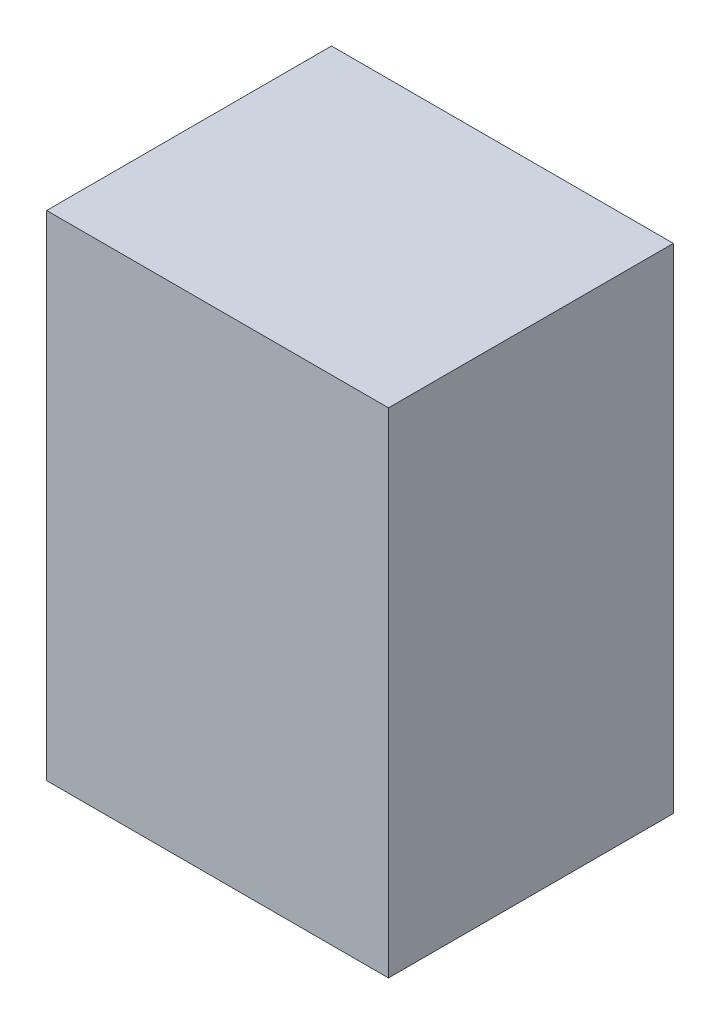
ISO-10303-21;
HEADER;
FILE_DESCRIPTION(('STEP AP214'),'2;1');
FILE_NAME('part.step','',(''),(''),'','','');
FILE_SCHEMA(('AUTOMOTIVE_DESIGN { 1 0 10303 214 1 1 1 1 }'));
ENDSEC;
DATA;
#1=APPLICATION_CONTEXT('core data for automotive mechanical design processes');
#2=APPLICATION_PROTOCOL_DEFINITION('international standard','automotive_design',2000,#1);
#3=PRODUCT_CONTEXT('',#1,'mechanical');
#4=PRODUCT('Part','Part','',(#3));
#5=PRODUCT_RELATED_PRODUCT_CATEGORY('part','',(#4));
#6=PRODUCT_DEFINITION_FORMATION('','',#4);
#7=PRODUCT_DEFINITION_CONTEXT('part definition',#1,'design');
#8=PRODUCT_DEFINITION('design','',#6,#7);
#9=PRODUCT_DEFINITION_SHAPE('','',#8);
#10=(LENGTH_UNIT() NAMED_UNIT(*) SI_UNIT(.MILLI.,.METRE.));
#11=(NAMED_UNIT(*) PLANE_ANGLE_UNIT() SI_UNIT($,.RADIAN.));
#12=(NAMED_UNIT(*) SI_UNIT($,.STERADIAN.) SOLID_ANGLE_UNIT());
#13=UNCERTAINTY_MEASURE_WITH_UNIT(LENGTH_MEASURE(1.E-05),#10,'distance_accuracy_value','');
#14=(GEOMETRIC_REPRESENTATION_CONTEXT(3) GLOBAL_UNCERTAINTY_ASSIGNED_CONTEXT((#13)) GLOBAL_UNIT_ASSIGNED_CONTEXT((#10,
#11,#12)) REPRESENTATION_CONTEXT('',''));
#15=CARTESIAN_POINT('',(0.,0.,0.));
#16=DIRECTION('',(0.,0.,1.));
#17=DIRECTION('',(1.,0.,0.));
#18=AXIS2_PLACEMENT_3D('',#15,#16,#17);
#19=CARTESIAN_POINT('',(-30.5427998353619,6.45596028905757,2.87531708400001));
#20=CARTESIAN_POINT('',(-30.5427998353619,6.45596028905757,1.97531583600001));
#21=CARTESIAN_POINT('',(-29.462801995362,6.45596028905757,2.87531708400001));
#22=CARTESIAN_POINT('',(-29.462801995362,6.45596028905757,1.97531583600001));
#23=(BOUNDED_SURFACE() B_SPLINE_SURFACE(1,1,((#19,#20),(#21,#22)),.UNSPECIFIED.,.F.,.F.,
.F.) B_SPLINE_SURFACE_WITH_KNOTS((2,2),(2,2),(-8.99998199999905E-05,0.000989998019999895),
(-0.000825001144,7.5000104E-05),
.UNSPECIFIED.) GEOMETRIC_REPRESENTATION_ITEM() RATIONAL_B_SPLINE_SURFACE(((1.,1.),(1.,1.))) REPRESENTATION_ITEM('') SURFACE());
#24=CARTESIAN_POINT('',(-30.4528000153619,6.45596028905757,2.05031594000001));
#25=CARTESIAN_POINT('',(-30.4528000153619,6.45596028905757,2.80031698000001));
#26=(BOUNDED_CURVE() B_SPLINE_CURVE(1,(#24,#25),.UNSPECIFIED.,.F.,
.F.) B_SPLINE_CURVE_WITH_KNOTS((2,2),(0.,0.00075000104),
.UNSPECIFIED.) CURVE() GEOMETRIC_REPRESENTATION_ITEM() RATIONAL_B_SPLINE_CURVE((1.,1.)) REPRESENTATION_ITEM(''));
#27=CARTESIAN_POINT('',(-30.4528000153619,6.45596028905757,2.05031594000001));
#28=VERTEX_POINT('',#27);
#29=CARTESIAN_POINT('',(-30.4528000153619,6.45596028905757,2.80031698000001));
#30=VERTEX_POINT('',#29);
#31=EDGE_CURVE('E56',#28,#30,#26,.T.);
#32=CARTESIAN_POINT('',(-30.4528000153619,6.45596028905757,2.80031698000001));
#33=CARTESIAN_POINT('',(-29.552801815362,6.45596028905757,2.80031698000001));
#34=(BOUNDED_CURVE() B_SPLINE_CURVE(1,(#32,#33),.UNSPECIFIED.,.F.,
.F.) B_SPLINE_CURVE_WITH_KNOTS((2,2),(0.,0.000899998199999903),
.UNSPECIFIED.) CURVE() GEOMETRIC_REPRESENTATION_ITEM() RATIONAL_B_SPLINE_CURVE((1.,1.)) REPRESENTATION_ITEM(''));
#35=CARTESIAN_POINT('',(-29.552801815362,6.45596028905757,2.80031698000001));
#36=VERTEX_POINT('',#35);
#37=EDGE_CURVE('E81',#30,#36,#34,.T.);
#38=CARTESIAN_POINT('',(-29.552801815362,6.45596028905757,2.05031594000001));
#39=CARTESIAN_POINT('',(-29.552801815362,6.45596028905757,2.80031698000001));
#40=(BOUNDED_CURVE() B_SPLINE_CURVE(1,(#38,#39),.UNSPECIFIED.,.F.,
.F.) B_SPLINE_CURVE_WITH_KNOTS((2,2),(0.,0.00075000104),
.UNSPECIFIED.) CURVE() GEOMETRIC_REPRESENTATION_ITEM() RATIONAL_B_SPLINE_CURVE((1.,1.)) REPRESENTATION_ITEM(''));
#41=CARTESIAN_POINT('',(-29.552801815362,6.45596028905757,2.05031594000001));
#42=VERTEX_POINT('',#41);
#43=EDGE_CURVE('E11',#42,#36,#40,.T.);
#44=CARTESIAN_POINT('',(-30.4528000153619,6.45596028905757,2.05031594000001));
#45=CARTESIAN_POINT('',(-29.552801815362,6.45596028905757,2.05031594000001));
#46=(BOUNDED_CURVE() B_SPLINE_CURVE(1,(#44,#45),.UNSPECIFIED.,.F.,
.F.) B_SPLINE_CURVE_WITH_KNOTS((2,2),(0.,0.000899998199999903),
.UNSPECIFIED.) CURVE() GEOMETRIC_REPRESENTATION_ITEM() RATIONAL_B_SPLINE_CURVE((1.,1.)) REPRESENTATION_ITEM(''));
#47=EDGE_CURVE('E76',#28,#42,#46,.T.);
#48=ORIENTED_EDGE('',*,*,#31,.T.);
#49=ORIENTED_EDGE('',*,*,#37,.T.);
#50=ORIENTED_EDGE('',*,*,#43,.F.);
#51=ORIENTED_EDGE('',*,*,#47,.F.);
#52=EDGE_LOOP('',(#48,#49,#50,#51));
#53=FACE_BOUND('',#52,.T.);
#54=ADVANCED_FACE('F17',(#53),#23,.T.);
#55=CARTESIAN_POINT('',(-29.552801815362,6.58596002905757,2.87531708400001));
#56=CARTESIAN_POINT('',(-29.552801815362,6.58596002905757,1.97531583600001));
#57=CARTESIAN_POINT('',(-29.552801815362,5.02596314905759,2.87531708400001));
#58=CARTESIAN_POINT('',(-29.552801815362,5.02596314905759,1.97531583600001));
#59=(BOUNDED_SURFACE() B_SPLINE_SURFACE(1,1,((#55,#56),(#57,#58)),.UNSPECIFIED.,.F.,.F.,
.F.) B_SPLINE_SURFACE_WITH_KNOTS((2,2),(2,2),(-0.000129999739999998,0.00142999713999998),
(-0.000825001144,7.5000104E-05),
.UNSPECIFIED.) GEOMETRIC_REPRESENTATION_ITEM() RATIONAL_B_SPLINE_SURFACE(((1.,1.),(1.,1.))) REPRESENTATION_ITEM('') SURFACE());
#60=CARTESIAN_POINT('',(-29.552801815362,6.45596028905757,2.80031698000001));
#61=CARTESIAN_POINT('',(-29.552801815362,5.15596288905759,2.80031698000001));
#62=(BOUNDED_CURVE() B_SPLINE_CURVE(1,(#60,#61),.UNSPECIFIED.,.F.,
.F.) B_SPLINE_CURVE_WITH_KNOTS((2,2),(0.,0.00129999739999998),
.UNSPECIFIED.) CURVE() GEOMETRIC_REPRESENTATION_ITEM() RATIONAL_B_SPLINE_CURVE((1.,1.)) REPRESENTATION_ITEM(''));
#63=CARTESIAN_POINT('',(-29.552801815362,5.15596288905759,2.80031698000001));
#64=VERTEX_POINT('',#63);
#65=EDGE_CURVE('E89',#36,#64,#62,.T.);
#66=CARTESIAN_POINT('',(-29.552801815362,5.15596288905759,2.05031594000001));
#67=CARTESIAN_POINT('',(-29.552801815362,5.15596288905759,2.80031698000001));
#68=(BOUNDED_CURVE() B_SPLINE_CURVE(1,(#66,#67),.UNSPECIFIED.,.F.,
.F.) B_SPLINE_CURVE_WITH_KNOTS((2,2),(0.,0.00075000104),
.UNSPECIFIED.) CURVE() GEOMETRIC_REPRESENTATION_ITEM() RATIONAL_B_SPLINE_CURVE((1.,1.)) REPRESENTATION_ITEM(''));
#69=CARTESIAN_POINT('',(-29.552801815362,5.15596288905759,2.05031594000001));
#70=VERTEX_POINT('',#69);
#71=EDGE_CURVE('E32',#70,#64,#68,.T.);
#72=CARTESIAN_POINT('',(-29.552801815362,6.45596028905757,2.05031594000001));
#73=CARTESIAN_POINT('',(-29.552801815362,5.15596288905759,2.05031594000001));
#74=(BOUNDED_CURVE() B_SPLINE_CURVE(1,(#72,#73),.UNSPECIFIED.,.F.,
.F.) B_SPLINE_CURVE_WITH_KNOTS((2,2),(0.,0.00129999739999998),
.UNSPECIFIED.) CURVE() GEOMETRIC_REPRESENTATION_ITEM() RATIONAL_B_SPLINE_CURVE((1.,1.)) REPRESENTATION_ITEM(''));
#75=EDGE_CURVE('E80',#42,#70,#74,.T.);
#76=ORIENTED_EDGE('',*,*,#43,.T.);
#77=ORIENTED_EDGE('',*,*,#65,.T.);
#78=ORIENTED_EDGE('',*,*,#71,.F.);
#79=ORIENTED_EDGE('',*,*,#75,.F.);
#80=EDGE_LOOP('',(#76,#77,#78,#79));
#81=FACE_BOUND('',#80,.T.);
#82=ADVANCED_FACE('F232',(#81),#59,.T.);
#83=CARTESIAN_POINT('',(-29.462801995362,5.15596288905759,2.87531708400001));
#84=CARTESIAN_POINT('',(-29.462801995362,5.15596288905759,1.97531583600001));
#85=CARTESIAN_POINT('',(-30.5427998353619,5.15596288905759,2.87531708400001));
#86=CARTESIAN_POINT('',(-30.5427998353619,5.15596288905759,1.97531583600001));
#87=(BOUNDED_SURFACE() B_SPLINE_SURFACE(1,1,((#83,#84),(#85,#86)),.UNSPECIFIED.,.F.,.F.,
.F.) B_SPLINE_SURFACE_WITH_KNOTS((2,2),(2,2),(-8.99998199999905E-05,0.000989998019999895),
(-0.000825001144,7.5000104E-05),
.UNSPECIFIED.) GEOMETRIC_REPRESENTATION_ITEM() RATIONAL_B_SPLINE_SURFACE(((1.,1.),(1.,1.))) REPRESENTATION_ITEM('') SURFACE());
#88=CARTESIAN_POINT('',(-29.552801815362,5.15596288905759,2.80031698000001));
#89=CARTESIAN_POINT('',(-30.4528000153619,5.15596288905759,2.80031698000001));
#90=(BOUNDED_CURVE() B_SPLINE_CURVE(1,(#88,#89),.UNSPECIFIED.,.F.,
.F.) B_SPLINE_CURVE_WITH_KNOTS((2,2),(0.,0.000899998199999903),
.UNSPECIFIED.) CURVE() GEOMETRIC_REPRESENTATION_ITEM() RATIONAL_B_SPLINE_CURVE((1.,1.)) REPRESENTATION_ITEM(''));
#91=CARTESIAN_POINT('',(-30.4528000153619,5.15596288905759,2.80031698000001));
#92=VERTEX_POINT('',#91);
#93=EDGE_CURVE('E102',#64,#92,#90,.T.);
#94=CARTESIAN_POINT('',(-30.4528000153619,5.15596288905759,2.05031594000001));
#95=CARTESIAN_POINT('',(-30.4528000153619,5.15596288905759,2.80031698000001));
#96=(BOUNDED_CURVE() B_SPLINE_CURVE(1,(#94,#95),.UNSPECIFIED.,.F.,
.F.) B_SPLINE_CURVE_WITH_KNOTS((2,2),(0.,0.00075000104),
.UNSPECIFIED.) CURVE() GEOMETRIC_REPRESENTATION_ITEM() RATIONAL_B_SPLINE_CURVE((1.,1.)) REPRESENTATION_ITEM(''));
#97=CARTESIAN_POINT('',(-30.4528000153619,5.15596288905759,2.05031594000001));
#98=VERTEX_POINT('',#97);
#99=EDGE_CURVE('E41',#98,#92,#96,.T.);
#100=CARTESIAN_POINT('',(-29.552801815362,5.15596288905759,2.05031594000001));
#101=CARTESIAN_POINT('',(-30.4528000153619,5.15596288905759,2.05031594000001));
#102=(BOUNDED_CURVE() B_SPLINE_CURVE(1,(#100,#101),.UNSPECIFIED.,.F.,
.F.) B_SPLINE_CURVE_WITH_KNOTS((2,2),(0.,0.000899998199999903),
.UNSPECIFIED.) CURVE() GEOMETRIC_REPRESENTATION_ITEM() RATIONAL_B_SPLINE_CURVE((1.,1.)) REPRESENTATION_ITEM(''));
#103=EDGE_CURVE('E77',#70,#98,#102,.T.);
#104=ORIENTED_EDGE('',*,*,#71,.T.);
#105=ORIENTED_EDGE('',*,*,#93,.T.);
#106=ORIENTED_EDGE('',*,*,#99,.F.);
#107=ORIENTED_EDGE('',*,*,#103,.F.);
#108=EDGE_LOOP('',(#104,#105,#106,#107));
#109=FACE_BOUND('',#108,.T.);
#110=ADVANCED_FACE('F236',(#109),#87,.T.);
#111=CARTESIAN_POINT('',(-30.4528000153619,5.02596314905759,2.87531708400001));
#112=CARTESIAN_POINT('',(-30.4528000153619,5.02596314905759,1.97531583600001));
#113=CARTESIAN_POINT('',(-30.4528000153619,6.58596002905757,2.87531708400001));
#114=CARTESIAN_POINT('',(-30.4528000153619,6.58596002905757,1.97531583600001));
#115=(BOUNDED_SURFACE() B_SPLINE_SURFACE(1,1,((#111,#112),(#113,#114)),.UNSPECIFIED.,.F.,.F.,
.F.) B_SPLINE_SURFACE_WITH_KNOTS((2,2),(2,2),(-0.000129999739999998,0.00142999713999998),
(-0.000825001144,7.5000104E-05),
.UNSPECIFIED.) GEOMETRIC_REPRESENTATION_ITEM() RATIONAL_B_SPLINE_SURFACE(((1.,1.),(1.,1.))) REPRESENTATION_ITEM('') SURFACE());
#116=CARTESIAN_POINT('',(-30.4528000153619,5.15596288905759,2.80031698000001));
#117=CARTESIAN_POINT('',(-30.4528000153619,6.45596028905757,2.80031698000001));
#118=(BOUNDED_CURVE() B_SPLINE_CURVE(1,(#116,#117),.UNSPECIFIED.,.F.,
.F.) B_SPLINE_CURVE_WITH_KNOTS((2,2),(0.,0.00129999739999998),
.UNSPECIFIED.) CURVE() GEOMETRIC_REPRESENTATION_ITEM() RATIONAL_B_SPLINE_CURVE((1.,1.)) REPRESENTATION_ITEM(''));
#119=EDGE_CURVE('E69',#92,#30,#118,.T.);
#120=CARTESIAN_POINT('',(-30.4528000153619,5.15596288905759,2.05031594000001));
#121=CARTESIAN_POINT('',(-30.4528000153619,6.45596028905757,2.05031594000001));
#122=(BOUNDED_CURVE() B_SPLINE_CURVE(1,(#120,#121),.UNSPECIFIED.,.F.,
.F.) B_SPLINE_CURVE_WITH_KNOTS((2,2),(0.,0.00129999739999998),
.UNSPECIFIED.) CURVE() GEOMETRIC_REPRESENTATION_ITEM() RATIONAL_B_SPLINE_CURVE((1.,1.)) REPRESENTATION_ITEM(''));
#123=EDGE_CURVE('E23',#98,#28,#122,.T.);
#124=ORIENTED_EDGE('',*,*,#99,.T.);
#125=ORIENTED_EDGE('',*,*,#119,.T.);
#126=ORIENTED_EDGE('',*,*,#31,.F.);
#127=ORIENTED_EDGE('',*,*,#123,.F.);
#128=EDGE_LOOP('',(#124,#125,#126,#127));
#129=FACE_BOUND('',#128,.T.);
#130=ADVANCED_FACE('F19',(#129),#115,.T.);
#131=CARTESIAN_POINT('',(-29.462801995362,5.02596314905759,2.05031594000001));
#132=CARTESIAN_POINT('',(-29.462801995362,6.58596002905757,2.05031594000001));
#133=CARTESIAN_POINT('',(-30.5427998353619,5.02596314905759,2.05031594000001));
#134=CARTESIAN_POINT('',(-30.5427998353619,6.58596002905757,2.05031594000001));
#135=(BOUNDED_SURFACE() B_SPLINE_SURFACE(1,1,((#131,#132),(#133,#134)),.UNSPECIFIED.,.F.,.F.,
.F.) B_SPLINE_SURFACE_WITH_KNOTS((2,2),(2,2),(-8.99998199999905E-05,0.000989998019999895),
(-0.00142999713999998,0.000129999739999998),
.UNSPECIFIED.) GEOMETRIC_REPRESENTATION_ITEM() RATIONAL_B_SPLINE_SURFACE(((1.,1.),(1.,1.))) REPRESENTATION_ITEM('') SURFACE());
#136=ORIENTED_EDGE('',*,*,#47,.T.);
#137=ORIENTED_EDGE('',*,*,#75,.T.);
#138=ORIENTED_EDGE('',*,*,#103,.T.);
#139=ORIENTED_EDGE('',*,*,#123,.T.);
#140=EDGE_LOOP('',(#136,#137,#138,#139));
#141=FACE_BOUND('',#140,.T.);
#142=ADVANCED_FACE('F74',(#141),#135,.T.);
#143=CARTESIAN_POINT('',(-30.5427998353619,5.02596314905759,2.80031698000001));
#144=CARTESIAN_POINT('',(-30.5427998353619,6.58596002905757,2.80031698000001));
#145=CARTESIAN_POINT('',(-29.462801995362,5.02596314905759,2.80031698000001));
#146=CARTESIAN_POINT('',(-29.462801995362,6.58596002905757,2.80031698000001));
#147=(BOUNDED_SURFACE() B_SPLINE_SURFACE(1,1,((#143,#144),(#145,#146)),.UNSPECIFIED.,.F.,.F.,
.F.) B_SPLINE_SURFACE_WITH_KNOTS((2,2),(2,2),(-8.99998199999905E-05,0.000989998019999895),
(-0.00142999713999998,0.000129999739999998),
.UNSPECIFIED.) GEOMETRIC_REPRESENTATION_ITEM() RATIONAL_B_SPLINE_SURFACE(((1.,1.),(1.,1.))) REPRESENTATION_ITEM('') SURFACE());
#148=ORIENTED_EDGE('',*,*,#119,.F.);
#149=ORIENTED_EDGE('',*,*,#93,.F.);
#150=ORIENTED_EDGE('',*,*,#65,.F.);
#151=ORIENTED_EDGE('',*,*,#37,.F.);
#152=EDGE_LOOP('',(#148,#149,#150,#151));
#153=FACE_BOUND('',#152,.T.);
#154=ADVANCED_FACE('F220',(#153),#147,.T.);
#155=CLOSED_SHELL('',(#54,#82,#110,#130,#142,#154));
#156=MANIFOLD_SOLID_BREP('B1',#155);
#157=ADVANCED_BREP_SHAPE_REPRESENTATION('',(#18,#156),#14);
#158=SHAPE_DEFINITION_REPRESENTATION(#9,#157);
ENDSEC;
END-ISO-10303-21;
